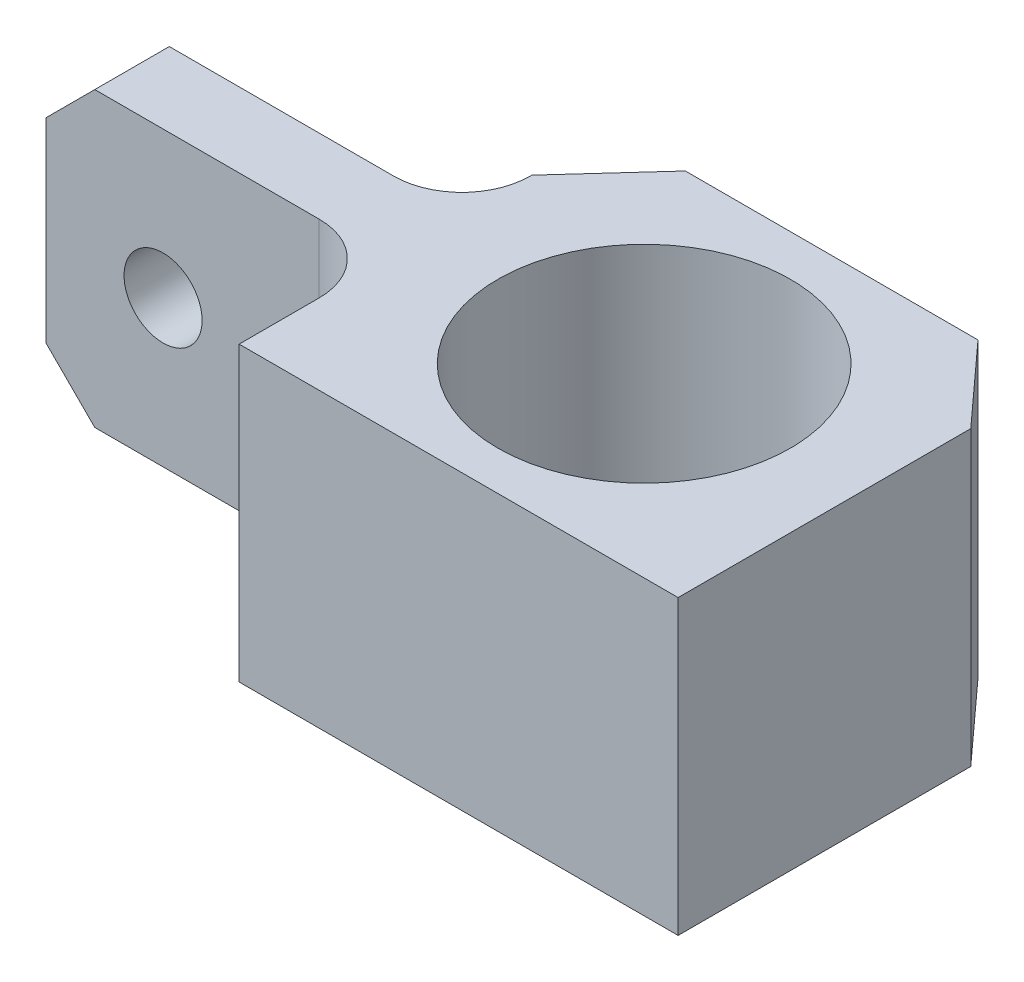
ISO-10303-21;
HEADER;
FILE_DESCRIPTION(('STEP AP214'),'2;1');
FILE_NAME('part.step','',(''),(''),'','','');
FILE_SCHEMA(('AUTOMOTIVE_DESIGN { 1 0 10303 214 1 1 1 1 }'));
ENDSEC;
DATA;
#1=APPLICATION_CONTEXT('core data for automotive mechanical design processes');
#2=APPLICATION_PROTOCOL_DEFINITION('international standard','automotive_design',2000,#1);
#3=PRODUCT_CONTEXT('',#1,'mechanical');
#4=PRODUCT('Part','Part','',(#3));
#5=PRODUCT_RELATED_PRODUCT_CATEGORY('part','',(#4));
#6=PRODUCT_DEFINITION_FORMATION('','',#4);
#7=PRODUCT_DEFINITION_CONTEXT('part definition',#1,'design');
#8=PRODUCT_DEFINITION('design','',#6,#7);
#9=PRODUCT_DEFINITION_SHAPE('','',#8);
#10=(LENGTH_UNIT() NAMED_UNIT(*) SI_UNIT(.MILLI.,.METRE.));
#11=(NAMED_UNIT(*) PLANE_ANGLE_UNIT() SI_UNIT($,.RADIAN.));
#12=(NAMED_UNIT(*) SI_UNIT($,.STERADIAN.) SOLID_ANGLE_UNIT());
#13=UNCERTAINTY_MEASURE_WITH_UNIT(LENGTH_MEASURE(1.E-05),#10,'distance_accuracy_value','');
#14=(GEOMETRIC_REPRESENTATION_CONTEXT(3) GLOBAL_UNCERTAINTY_ASSIGNED_CONTEXT((#13)) GLOBAL_UNIT_ASSIGNED_CONTEXT((#10,
#11,#12)) REPRESENTATION_CONTEXT('',''));
#15=CARTESIAN_POINT('',(0.,0.,0.));
#16=DIRECTION('',(0.,0.,1.));
#17=DIRECTION('',(1.,0.,0.));
#18=AXIS2_PLACEMENT_3D('',#15,#16,#17);
#19=CARTESIAN_POINT('',(-22.5,30.,19.019063341913));
#20=DIRECTION('',(1.,0.,0.));
#21=DIRECTION('',(0.,0.,-1.));
#22=AXIS2_PLACEMENT_3D('',#19,#20,#21);
#23=PLANE('',#22);
#24=DIRECTION('',(0.,0.,1.));
#25=VECTOR('',#24,1.);
#26=CARTESIAN_POINT('',(-22.5,30.,19.019063341913));
#27=LINE('',#26,#25);
#28=CARTESIAN_POINT('',(-22.5,30.,10.82));
#29=VERTEX_POINT('',#28);
#30=CARTESIAN_POINT('',(-22.5,30.,19.019063341913));
#31=VERTEX_POINT('',#30);
#32=EDGE_CURVE('E184',#29,#31,#27,.T.);
#33=ORIENTED_EDGE('',*,*,#32,.F.);
#34=DIRECTION('',(0.,1.,0.));
#35=VECTOR('',#34,1.);
#36=CARTESIAN_POINT('',(-22.5,0.,10.82));
#37=LINE('',#36,#35);
#38=CARTESIAN_POINT('',(-22.5,0.,10.82));
#39=VERTEX_POINT('',#38);
#40=EDGE_CURVE('E52',#29,#39,#37,.F.);
#41=ORIENTED_EDGE('',*,*,#40,.T.);
#42=DIRECTION('',(0.,0.,1.));
#43=VECTOR('',#42,1.);
#44=CARTESIAN_POINT('',(-22.5,0.,19.019063341913));
#45=LINE('',#44,#43);
#46=CARTESIAN_POINT('',(-22.5,0.,19.019063341913));
#47=VERTEX_POINT('',#46);
#48=EDGE_CURVE('E168',#39,#47,#45,.T.);
#49=ORIENTED_EDGE('',*,*,#48,.T.);
#50=DIRECTION('',(0.,-1.,0.));
#51=VECTOR('',#50,1.);
#52=CARTESIAN_POINT('',(-22.5,30.,19.019063341913));
#53=LINE('',#52,#51);
#54=EDGE_CURVE('E216',#31,#47,#53,.T.);
#55=ORIENTED_EDGE('',*,*,#54,.F.);
#56=EDGE_LOOP('',(#33,#41,#49,#55));
#57=FACE_BOUND('',#56,.T.);
#58=ADVANCED_FACE('F31',(#57),#23,.F.);
#59=CARTESIAN_POINT('',(-22.5,0.,-10.980936658087));
#60=VERTEX_POINT('',#59);
#61=CARTESIAN_POINT('',(-22.5,0.,-10.82));
#62=VERTEX_POINT('',#61);
#63=EDGE_CURVE('E164',#60,#62,#45,.T.);
#64=ORIENTED_EDGE('',*,*,#63,.T.);
#65=DIRECTION('',(0.,-1.,0.));
#66=VECTOR('',#65,1.);
#67=CARTESIAN_POINT('',(-22.5,30.,-10.82));
#68=LINE('',#67,#66);
#69=CARTESIAN_POINT('',(-22.5,30.,-10.82));
#70=VERTEX_POINT('',#69);
#71=EDGE_CURVE('E228',#62,#70,#68,.F.);
#72=ORIENTED_EDGE('',*,*,#71,.T.);
#73=CARTESIAN_POINT('',(-22.5,30.,-10.980936658087));
#74=VERTEX_POINT('',#73);
#75=EDGE_CURVE('E169',#74,#70,#27,.T.);
#76=ORIENTED_EDGE('',*,*,#75,.F.);
#77=DIRECTION('',(0.,-1.,0.));
#78=VECTOR('',#77,1.);
#79=CARTESIAN_POINT('',(-22.5,30.,-10.980936658087));
#80=LINE('',#79,#78);
#81=EDGE_CURVE('E208',#74,#60,#80,.T.);
#82=ORIENTED_EDGE('',*,*,#81,.T.);
#83=EDGE_LOOP('',(#64,#72,#76,#82));
#84=FACE_BOUND('',#83,.T.);
#85=ADVANCED_FACE('F213',(#84),#23,.F.);
#86=CARTESIAN_POINT('',(22.5,30.,-10.9809366580871));
#87=DIRECTION('',(-1.,0.,0.));
#88=DIRECTION('',(0.,0.,1.));
#89=AXIS2_PLACEMENT_3D('',#86,#87,#88);
#90=PLANE('',#89);
#91=DIRECTION('',(0.,0.,-1.));
#92=VECTOR('',#91,1.);
#93=CARTESIAN_POINT('',(22.5,0.,-10.9809366580871));
#94=LINE('',#93,#92);
#95=CARTESIAN_POINT('',(22.5,0.,19.0190633419129));
#96=VERTEX_POINT('',#95);
#97=CARTESIAN_POINT('',(22.5,0.,-10.9809366580871));
#98=VERTEX_POINT('',#97);
#99=EDGE_CURVE('E154',#96,#98,#94,.T.);
#100=ORIENTED_EDGE('',*,*,#99,.T.);
#101=DIRECTION('',(0.,-1.,0.));
#102=VECTOR('',#101,1.);
#103=CARTESIAN_POINT('',(22.5,30.,-10.9809366580871));
#104=LINE('',#103,#102);
#105=CARTESIAN_POINT('',(22.5,30.,-10.9809366580871));
#106=VERTEX_POINT('',#105);
#107=EDGE_CURVE('E134',#106,#98,#104,.T.);
#108=ORIENTED_EDGE('',*,*,#107,.F.);
#109=DIRECTION('',(0.,0.,-1.));
#110=VECTOR('',#109,1.);
#111=CARTESIAN_POINT('',(22.5,30.,-10.9809366580871));
#112=LINE('',#111,#110);
#113=CARTESIAN_POINT('',(22.5,30.,19.0190633419129));
#114=VERTEX_POINT('',#113);
#115=EDGE_CURVE('E140',#114,#106,#112,.T.);
#116=ORIENTED_EDGE('',*,*,#115,.F.);
#117=DIRECTION('',(0.,-1.,0.));
#118=VECTOR('',#117,1.);
#119=CARTESIAN_POINT('',(22.5,30.,19.0190633419129));
#120=LINE('',#119,#118);
#121=EDGE_CURVE('E193',#114,#96,#120,.T.);
#122=ORIENTED_EDGE('',*,*,#121,.T.);
#123=EDGE_LOOP('',(#100,#108,#116,#122));
#124=FACE_BOUND('',#123,.T.);
#125=ADVANCED_FACE('F152',(#124),#90,.F.);
#126=CARTESIAN_POINT('',(15.,30.,-19.2234627298298));
#127=DIRECTION('',(-0.739636528859752,0.,0.67300654170394));
#128=DIRECTION('',(0.67300654170394,0.,0.739636528859752));
#129=AXIS2_PLACEMENT_3D('',#126,#127,#128);
#130=PLANE('',#129);
#131=DIRECTION('',(-0.67300654170394,0.,-0.739636528859752));
#132=VECTOR('',#131,1.);
#133=CARTESIAN_POINT('',(15.,0.,-19.2234627298298));
#134=LINE('',#133,#132);
#135=CARTESIAN_POINT('',(15.,0.,-19.2234627298298));
#136=VERTEX_POINT('',#135);
#137=EDGE_CURVE('E195',#98,#136,#134,.T.);
#138=ORIENTED_EDGE('',*,*,#137,.T.);
#139=DIRECTION('',(0.,-1.,0.));
#140=VECTOR('',#139,1.);
#141=CARTESIAN_POINT('',(15.,30.,-19.2234627298298));
#142=LINE('',#141,#140);
#143=CARTESIAN_POINT('',(15.,30.,-19.2234627298298));
#144=VERTEX_POINT('',#143);
#145=EDGE_CURVE('E137',#144,#136,#142,.T.);
#146=ORIENTED_EDGE('',*,*,#145,.F.);
#147=DIRECTION('',(-0.67300654170394,0.,-0.739636528859752));
#148=VECTOR('',#147,1.);
#149=CARTESIAN_POINT('',(15.,30.,-19.2234627298298));
#150=LINE('',#149,#148);
#151=EDGE_CURVE('E130',#106,#144,#150,.T.);
#152=ORIENTED_EDGE('',*,*,#151,.F.);
#153=ORIENTED_EDGE('',*,*,#107,.T.);
#154=EDGE_LOOP('',(#138,#146,#152,#153));
#155=FACE_BOUND('',#154,.T.);
#156=ADVANCED_FACE('F132',(#155),#130,.F.);
#157=CARTESIAN_POINT('',(-15.,30.,-19.2234627298298));
#158=DIRECTION('',(0.,0.,1.));
#159=DIRECTION('',(1.,0.,0.));
#160=AXIS2_PLACEMENT_3D('',#157,#158,#159);
#161=PLANE('',#160);
#162=DIRECTION('',(-1.,0.,0.));
#163=VECTOR('',#162,1.);
#164=CARTESIAN_POINT('',(-15.,0.,-19.2234627298298));
#165=LINE('',#164,#163);
#166=CARTESIAN_POINT('',(-15.,0.,-19.2234627298298));
#167=VERTEX_POINT('',#166);
#168=EDGE_CURVE('E197',#136,#167,#165,.T.);
#169=ORIENTED_EDGE('',*,*,#168,.T.);
#170=DIRECTION('',(0.,-1.,0.));
#171=VECTOR('',#170,1.);
#172=CARTESIAN_POINT('',(-15.,30.,-19.2234627298298));
#173=LINE('',#172,#171);
#174=CARTESIAN_POINT('',(-15.,30.,-19.2234627298298));
#175=VERTEX_POINT('',#174);
#176=EDGE_CURVE('E160',#175,#167,#173,.T.);
#177=ORIENTED_EDGE('',*,*,#176,.F.);
#178=DIRECTION('',(-1.,0.,0.));
#179=VECTOR('',#178,1.);
#180=CARTESIAN_POINT('',(-15.,30.,-19.2234627298298));
#181=LINE('',#180,#179);
#182=EDGE_CURVE('E139',#144,#175,#181,.T.);
#183=ORIENTED_EDGE('',*,*,#182,.F.);
#184=ORIENTED_EDGE('',*,*,#145,.T.);
#185=EDGE_LOOP('',(#169,#177,#183,#184));
#186=FACE_BOUND('',#185,.T.);
#187=ADVANCED_FACE('F319',(#186),#161,.F.);
#188=CARTESIAN_POINT('',(-22.5,30.,-10.980936658087));
#189=DIRECTION('',(0.739636528859752,0.,0.67300654170394));
#190=DIRECTION('',(0.67300654170394,0.,-0.739636528859752));
#191=AXIS2_PLACEMENT_3D('',#188,#189,#190);
#192=PLANE('',#191);
#193=DIRECTION('',(-0.67300654170394,0.,0.739636528859752));
#194=VECTOR('',#193,1.);
#195=CARTESIAN_POINT('',(-22.5,0.,-10.980936658087));
#196=LINE('',#195,#194);
#197=EDGE_CURVE('E175',#167,#60,#196,.T.);
#198=ORIENTED_EDGE('',*,*,#197,.T.);
#199=ORIENTED_EDGE('',*,*,#81,.F.);
#200=DIRECTION('',(-0.67300654170394,0.,0.739636528859752));
#201=VECTOR('',#200,1.);
#202=CARTESIAN_POINT('',(-22.5,30.,-10.980936658087));
#203=LINE('',#202,#201);
#204=EDGE_CURVE('E186',#175,#74,#203,.T.);
#205=ORIENTED_EDGE('',*,*,#204,.F.);
#206=ORIENTED_EDGE('',*,*,#176,.T.);
#207=EDGE_LOOP('',(#198,#199,#205,#206));
#208=FACE_BOUND('',#207,.T.);
#209=ADVANCED_FACE('F206',(#208),#192,.F.);
#210=CARTESIAN_POINT('',(22.5,30.,19.0190633419129));
#211=DIRECTION('',(0.,0.,-1.));
#212=DIRECTION('',(-1.,0.,0.));
#213=AXIS2_PLACEMENT_3D('',#210,#211,#212);
#214=PLANE('',#213);
#215=DIRECTION('',(1.,0.,0.));
#216=VECTOR('',#215,1.);
#217=CARTESIAN_POINT('',(22.5,0.,19.0190633419129));
#218=LINE('',#217,#216);
#219=EDGE_CURVE('E150',#47,#96,#218,.T.);
#220=ORIENTED_EDGE('',*,*,#219,.T.);
#221=ORIENTED_EDGE('',*,*,#121,.F.);
#222=DIRECTION('',(1.,0.,0.));
#223=VECTOR('',#222,1.);
#224=CARTESIAN_POINT('',(22.5,30.,19.0190633419129));
#225=LINE('',#224,#223);
#226=EDGE_CURVE('E146',#31,#114,#225,.T.);
#227=ORIENTED_EDGE('',*,*,#226,.F.);
#228=ORIENTED_EDGE('',*,*,#54,.T.);
#229=EDGE_LOOP('',(#220,#221,#227,#228));
#230=FACE_BOUND('',#229,.T.);
#231=ADVANCED_FACE('F315',(#230),#214,.F.);
#232=CARTESIAN_POINT('',(22.5,30.,19.0190633419129));
#233=DIRECTION('',(0.,-1.,0.));
#234=DIRECTION('',(0.,0.,-1.));
#235=AXIS2_PLACEMENT_3D('',#232,#233,#234);
#236=PLANE('',#235);
#237=CARTESIAN_POINT('',(0.,30.,0.));
#238=DIRECTION('',(0.,1.,0.));
#239=DIRECTION('',(0.,0.,1.));
#240=AXIS2_PLACEMENT_3D('',#237,#238,#239);
#241=CIRCLE('',#240,15.);
#242=CARTESIAN_POINT('',(0.,30.,15.));
#243=VERTEX_POINT('',#242);
#244=EDGE_CURVE('E261',#243,#243,#241,.T.);
#245=ORIENTED_EDGE('',*,*,#244,.F.);
#246=EDGE_LOOP('',(#245));
#247=FACE_BOUND('',#246,.T.);
#248=DIRECTION('',(1.,0.,0.));
#249=VECTOR('',#248,1.);
#250=CARTESIAN_POINT('',(-57.5,30.,-3.81999999999999));
#251=LINE('',#250,#249);
#252=CARTESIAN_POINT('',(-52.5,30.,-3.81999999999999));
#253=VERTEX_POINT('',#252);
#254=CARTESIAN_POINT('',(-29.5,30.,-3.81999999999999));
#255=VERTEX_POINT('',#254);
#256=EDGE_CURVE('E246',#253,#255,#251,.T.);
#257=ORIENTED_EDGE('',*,*,#256,.F.);
#258=DIRECTION('',(0.,0.,1.));
#259=VECTOR('',#258,1.);
#260=CARTESIAN_POINT('',(-52.5,30.,3.82000000000001));
#261=LINE('',#260,#259);
#262=CARTESIAN_POINT('',(-52.5,30.,3.82000000000001));
#263=VERTEX_POINT('',#262);
#264=EDGE_CURVE('E234',#253,#263,#261,.T.);
#265=ORIENTED_EDGE('',*,*,#264,.T.);
#266=DIRECTION('',(1.,0.,0.));
#267=VECTOR('',#266,1.);
#268=CARTESIAN_POINT('',(-57.5,30.,3.82000000000001));
#269=LINE('',#268,#267);
#270=CARTESIAN_POINT('',(-29.5,30.,3.82000000000001));
#271=VERTEX_POINT('',#270);
#272=EDGE_CURVE('E250',#263,#271,#269,.T.);
#273=ORIENTED_EDGE('',*,*,#272,.T.);
#274=CARTESIAN_POINT('',(-29.5,30.,10.82));
#275=DIRECTION('',(0.,-1.,0.));
#276=DIRECTION('',(0.,0.,-1.));
#277=AXIS2_PLACEMENT_3D('',#274,#275,#276);
#278=CIRCLE('',#277,7.);
#279=EDGE_CURVE('E39',#271,#29,#278,.T.);
#280=ORIENTED_EDGE('',*,*,#279,.T.);
#281=ORIENTED_EDGE('',*,*,#32,.T.);
#282=ORIENTED_EDGE('',*,*,#226,.T.);
#283=ORIENTED_EDGE('',*,*,#115,.T.);
#284=ORIENTED_EDGE('',*,*,#151,.T.);
#285=ORIENTED_EDGE('',*,*,#182,.T.);
#286=ORIENTED_EDGE('',*,*,#204,.T.);
#287=ORIENTED_EDGE('',*,*,#75,.T.);
#288=CARTESIAN_POINT('',(-29.5,30.,-10.82));
#289=DIRECTION('',(0.,-1.,0.));
#290=DIRECTION('',(0.,0.,-1.));
#291=AXIS2_PLACEMENT_3D('',#288,#289,#290);
#292=CIRCLE('',#291,7.);
#293=EDGE_CURVE('E227',#70,#255,#292,.T.);
#294=ORIENTED_EDGE('',*,*,#293,.T.);
#295=EDGE_LOOP('',(#257,#265,#273,#280,#281,#282,#283,#284,#285,#286,#287,#294));
#296=FACE_BOUND('',#295,.T.);
#297=ADVANCED_FACE('F144',(#247,#296),#236,.F.);
#298=CARTESIAN_POINT('',(22.5,0.,19.0190633419129));
#299=DIRECTION('',(0.,-1.,0.));
#300=DIRECTION('',(0.,0.,-1.));
#301=AXIS2_PLACEMENT_3D('',#298,#299,#300);
#302=PLANE('',#301);
#303=CARTESIAN_POINT('',(0.,0.,0.));
#304=DIRECTION('',(0.,1.,0.));
#305=DIRECTION('',(0.,0.,1.));
#306=AXIS2_PLACEMENT_3D('',#303,#304,#305);
#307=CIRCLE('',#306,15.);
#308=CARTESIAN_POINT('',(0.,0.,15.));
#309=VERTEX_POINT('',#308);
#310=EDGE_CURVE('E196',#309,#309,#307,.T.);
#311=ORIENTED_EDGE('',*,*,#310,.T.);
#312=EDGE_LOOP('',(#311));
#313=FACE_BOUND('',#312,.T.);
#314=DIRECTION('',(1.,0.,0.));
#315=VECTOR('',#314,1.);
#316=CARTESIAN_POINT('',(-57.5,0.,3.82000000000001));
#317=LINE('',#316,#315);
#318=CARTESIAN_POINT('',(-52.5,0.,3.82000000000001));
#319=VERTEX_POINT('',#318);
#320=CARTESIAN_POINT('',(-29.5,0.,3.82000000000001));
#321=VERTEX_POINT('',#320);
#322=EDGE_CURVE('E262',#319,#321,#317,.T.);
#323=ORIENTED_EDGE('',*,*,#322,.F.);
#324=DIRECTION('',(0.,0.,-1.));
#325=VECTOR('',#324,1.);
#326=CARTESIAN_POINT('',(-52.5,0.,19.0190633419129));
#327=LINE('',#326,#325);
#328=CARTESIAN_POINT('',(-52.5,0.,-3.81999999999999));
#329=VERTEX_POINT('',#328);
#330=EDGE_CURVE('E245',#319,#329,#327,.T.);
#331=ORIENTED_EDGE('',*,*,#330,.T.);
#332=DIRECTION('',(1.,0.,0.));
#333=VECTOR('',#332,1.);
#334=CARTESIAN_POINT('',(-57.5,0.,-3.81999999999999));
#335=LINE('',#334,#333);
#336=CARTESIAN_POINT('',(-29.5,0.,-3.81999999999999));
#337=VERTEX_POINT('',#336);
#338=EDGE_CURVE('E223',#329,#337,#335,.T.);
#339=ORIENTED_EDGE('',*,*,#338,.T.);
#340=CARTESIAN_POINT('',(-29.5,0.,-10.82));
#341=DIRECTION('',(0.,-1.,0.));
#342=DIRECTION('',(0.,0.,-1.));
#343=AXIS2_PLACEMENT_3D('',#340,#341,#342);
#344=CIRCLE('',#343,7.);
#345=EDGE_CURVE('E221',#337,#62,#344,.F.);
#346=ORIENTED_EDGE('',*,*,#345,.T.);
#347=ORIENTED_EDGE('',*,*,#63,.F.);
#348=ORIENTED_EDGE('',*,*,#197,.F.);
#349=ORIENTED_EDGE('',*,*,#168,.F.);
#350=ORIENTED_EDGE('',*,*,#137,.F.);
#351=ORIENTED_EDGE('',*,*,#99,.F.);
#352=ORIENTED_EDGE('',*,*,#219,.F.);
#353=ORIENTED_EDGE('',*,*,#48,.F.);
#354=CARTESIAN_POINT('',(-29.5,0.,10.82));
#355=DIRECTION('',(0.,-1.,0.));
#356=DIRECTION('',(0.,0.,-1.));
#357=AXIS2_PLACEMENT_3D('',#354,#355,#356);
#358=CIRCLE('',#357,7.);
#359=EDGE_CURVE('E11',#39,#321,#358,.F.);
#360=ORIENTED_EDGE('',*,*,#359,.T.);
#361=EDGE_LOOP('',(#323,#331,#339,#346,#347,#348,#349,#350,#351,#352,#353,#360));
#362=FACE_BOUND('',#361,.T.);
#363=ADVANCED_FACE('F219',(#313,#362),#302,.T.);
#364=CARTESIAN_POINT('',(0.,0.,0.));
#365=DIRECTION('',(0.,1.,0.));
#366=DIRECTION('',(0.,0.,1.));
#367=AXIS2_PLACEMENT_3D('',#364,#365,#366);
#368=CYLINDRICAL_SURFACE('',#367,15.);
#369=ORIENTED_EDGE('',*,*,#310,.F.);
#370=EDGE_LOOP('',(#369));
#371=FACE_BOUND('',#370,.T.);
#372=ORIENTED_EDGE('',*,*,#244,.T.);
#373=EDGE_LOOP('',(#372));
#374=FACE_BOUND('',#373,.T.);
#375=ADVANCED_FACE('F349',(#371,#374),#368,.F.);
#376=CARTESIAN_POINT('',(-57.5,30.,3.82000000000001));
#377=DIRECTION('',(0.,0.,-1.));
#378=DIRECTION('',(-1.,0.,0.));
#379=AXIS2_PLACEMENT_3D('',#376,#377,#378);
#380=PLANE('',#379);
#381=CARTESIAN_POINT('',(-45.5,15.,3.82));
#382=DIRECTION('',(0.,0.,1.));
#383=DIRECTION('',(1.,0.,0.));
#384=AXIS2_PLACEMENT_3D('',#381,#382,#383);
#385=CIRCLE('',#384,4.00000000000001);
#386=CARTESIAN_POINT('',(-41.5,15.,3.82));
#387=VERTEX_POINT('',#386);
#388=EDGE_CURVE('E239',#387,#387,#385,.T.);
#389=ORIENTED_EDGE('',*,*,#388,.F.);
#390=EDGE_LOOP('',(#389));
#391=FACE_BOUND('',#390,.T.);
#392=ORIENTED_EDGE('',*,*,#322,.T.);
#393=DIRECTION('',(0.,1.,0.));
#394=VECTOR('',#393,1.);
#395=CARTESIAN_POINT('',(-29.5,30.,3.82000000000001));
#396=LINE('',#395,#394);
#397=EDGE_CURVE('E182',#321,#271,#396,.T.);
#398=ORIENTED_EDGE('',*,*,#397,.T.);
#399=ORIENTED_EDGE('',*,*,#272,.F.);
#400=DIRECTION('',(-0.707106781186549,-0.707106781186546,0.));
#401=VECTOR('',#400,1.);
#402=CARTESIAN_POINT('',(-57.5,25.,3.82000000000001));
#403=LINE('',#402,#401);
#404=CARTESIAN_POINT('',(-57.5,25.,3.82000000000001));
#405=VERTEX_POINT('',#404);
#406=EDGE_CURVE('E266',#263,#405,#403,.T.);
#407=ORIENTED_EDGE('',*,*,#406,.T.);
#408=DIRECTION('',(0.,1.,0.));
#409=VECTOR('',#408,1.);
#410=CARTESIAN_POINT('',(-57.5,30.,3.82000000000001));
#411=LINE('',#410,#409);
#412=CARTESIAN_POINT('',(-57.5,4.99999999999998,3.82000000000001));
#413=VERTEX_POINT('',#412);
#414=EDGE_CURVE('E238',#413,#405,#411,.T.);
#415=ORIENTED_EDGE('',*,*,#414,.F.);
#416=DIRECTION('',(-0.707106781186549,0.707106781186546,0.));
#417=VECTOR('',#416,1.);
#418=CARTESIAN_POINT('',(-57.5,4.99999999999998,3.82000000000001));
#419=LINE('',#418,#417);
#420=EDGE_CURVE('E268',#413,#319,#419,.F.);
#421=ORIENTED_EDGE('',*,*,#420,.T.);
#422=EDGE_LOOP('',(#392,#398,#399,#407,#415,#421));
#423=FACE_BOUND('',#422,.T.);
#424=ADVANCED_FACE('F285',(#391,#423),#380,.F.);
#425=CARTESIAN_POINT('',(-57.5,30.,-3.81999999999999));
#426=DIRECTION('',(0.,0.,1.));
#427=DIRECTION('',(1.,0.,0.));
#428=AXIS2_PLACEMENT_3D('',#425,#426,#427);
#429=PLANE('',#428);
#430=CARTESIAN_POINT('',(-45.5,15.,-3.81999999999999));
#431=DIRECTION('',(0.,0.,1.));
#432=DIRECTION('',(1.,0.,0.));
#433=AXIS2_PLACEMENT_3D('',#430,#431,#432);
#434=CIRCLE('',#433,4.00000000000001);
#435=CARTESIAN_POINT('',(-41.5,15.,-3.81999999999999));
#436=VERTEX_POINT('',#435);
#437=EDGE_CURVE('E235',#436,#436,#434,.T.);
#438=ORIENTED_EDGE('',*,*,#437,.T.);
#439=EDGE_LOOP('',(#438));
#440=FACE_BOUND('',#439,.T.);
#441=ORIENTED_EDGE('',*,*,#256,.T.);
#442=DIRECTION('',(0.,-1.,0.));
#443=VECTOR('',#442,1.);
#444=CARTESIAN_POINT('',(-29.5,0.,-3.81999999999999));
#445=LINE('',#444,#443);
#446=EDGE_CURVE('E230',#255,#337,#445,.T.);
#447=ORIENTED_EDGE('',*,*,#446,.T.);
#448=ORIENTED_EDGE('',*,*,#338,.F.);
#449=DIRECTION('',(0.707106781186549,-0.707106781186546,0.));
#450=VECTOR('',#449,1.);
#451=CARTESIAN_POINT('',(-57.5,4.99999999999998,-3.81999999999999));
#452=LINE('',#451,#450);
#453=CARTESIAN_POINT('',(-57.5,4.99999999999998,-3.81999999999999));
#454=VERTEX_POINT('',#453);
#455=EDGE_CURVE('E241',#329,#454,#452,.F.);
#456=ORIENTED_EDGE('',*,*,#455,.T.);
#457=DIRECTION('',(0.,-1.,0.));
#458=VECTOR('',#457,1.);
#459=CARTESIAN_POINT('',(-57.5,30.,-3.81999999999999));
#460=LINE('',#459,#458);
#461=CARTESIAN_POINT('',(-57.5,25.,-3.81999999999999));
#462=VERTEX_POINT('',#461);
#463=EDGE_CURVE('E265',#462,#454,#460,.T.);
#464=ORIENTED_EDGE('',*,*,#463,.F.);
#465=DIRECTION('',(0.707106781186549,0.707106781186546,0.));
#466=VECTOR('',#465,1.);
#467=CARTESIAN_POINT('',(-57.5,25.,-3.81999999999999));
#468=LINE('',#467,#466);
#469=EDGE_CURVE('E243',#462,#253,#468,.T.);
#470=ORIENTED_EDGE('',*,*,#469,.T.);
#471=EDGE_LOOP('',(#441,#447,#448,#456,#464,#470));
#472=FACE_BOUND('',#471,.T.);
#473=ADVANCED_FACE('F275',(#440,#472),#429,.F.);
#474=CARTESIAN_POINT('',(-57.5,0.,3.82000000000001));
#475=DIRECTION('',(-1.,0.,0.));
#476=DIRECTION('',(0.,0.,1.));
#477=AXIS2_PLACEMENT_3D('',#474,#475,#476);
#478=PLANE('',#477);
#479=ORIENTED_EDGE('',*,*,#463,.T.);
#480=DIRECTION('',(0.,0.,1.));
#481=VECTOR('',#480,1.);
#482=CARTESIAN_POINT('',(-57.5,4.99999999999998,3.82000000000001));
#483=LINE('',#482,#481);
#484=EDGE_CURVE('E158',#454,#413,#483,.T.);
#485=ORIENTED_EDGE('',*,*,#484,.T.);
#486=ORIENTED_EDGE('',*,*,#414,.T.);
#487=DIRECTION('',(0.,0.,-1.));
#488=VECTOR('',#487,1.);
#489=CARTESIAN_POINT('',(-57.5,25.,-3.81999999999999));
#490=LINE('',#489,#488);
#491=EDGE_CURVE('E155',#405,#462,#490,.T.);
#492=ORIENTED_EDGE('',*,*,#491,.T.);
#493=EDGE_LOOP('',(#479,#485,#486,#492));
#494=FACE_BOUND('',#493,.T.);
#495=ADVANCED_FACE('F283',(#494),#478,.T.);
#496=CARTESIAN_POINT('',(-57.5,4.99999999999998,3.82000000000001));
#497=DIRECTION('',(0.707106781186546,0.707106781186549,0.));
#498=DIRECTION('',(-0.707106781186549,0.707106781186546,0.));
#499=AXIS2_PLACEMENT_3D('',#496,#497,#498);
#500=PLANE('',#499);
#501=ORIENTED_EDGE('',*,*,#455,.F.);
#502=ORIENTED_EDGE('',*,*,#330,.F.);
#503=ORIENTED_EDGE('',*,*,#420,.F.);
#504=ORIENTED_EDGE('',*,*,#484,.F.);
#505=EDGE_LOOP('',(#501,#502,#503,#504));
#506=FACE_BOUND('',#505,.T.);
#507=ADVANCED_FACE('F279',(#506),#500,.F.);
#508=CARTESIAN_POINT('',(-57.5,25.,3.82000000000001));
#509=DIRECTION('',(-0.707106781186546,0.707106781186549,0.));
#510=DIRECTION('',(-0.707106781186549,-0.707106781186546,0.));
#511=AXIS2_PLACEMENT_3D('',#508,#509,#510);
#512=PLANE('',#511);
#513=ORIENTED_EDGE('',*,*,#406,.F.);
#514=ORIENTED_EDGE('',*,*,#264,.F.);
#515=ORIENTED_EDGE('',*,*,#469,.F.);
#516=ORIENTED_EDGE('',*,*,#491,.F.);
#517=EDGE_LOOP('',(#513,#514,#515,#516));
#518=FACE_BOUND('',#517,.T.);
#519=ADVANCED_FACE('F304',(#518),#512,.T.);
#520=CARTESIAN_POINT('',(-45.5,15.,-19.2234627298298));
#521=DIRECTION('',(0.,0.,1.));
#522=DIRECTION('',(1.,0.,0.));
#523=AXIS2_PLACEMENT_3D('',#520,#521,#522);
#524=CYLINDRICAL_SURFACE('',#523,4.00000000000001);
#525=ORIENTED_EDGE('',*,*,#388,.T.);
#526=EDGE_LOOP('',(#525));
#527=FACE_BOUND('',#526,.T.);
#528=ORIENTED_EDGE('',*,*,#437,.F.);
#529=EDGE_LOOP('',(#528));
#530=FACE_BOUND('',#529,.T.);
#531=ADVANCED_FACE('F298',(#527,#530),#524,.F.);
#532=CARTESIAN_POINT('',(-29.5,30.,-10.82));
#533=DIRECTION('',(0.,1.,0.));
#534=DIRECTION('',(0.,0.,1.));
#535=AXIS2_PLACEMENT_3D('',#532,#533,#534);
#536=CYLINDRICAL_SURFACE('',#535,7.);
#537=ORIENTED_EDGE('',*,*,#293,.F.);
#538=ORIENTED_EDGE('',*,*,#71,.F.);
#539=ORIENTED_EDGE('',*,*,#345,.F.);
#540=ORIENTED_EDGE('',*,*,#446,.F.);
#541=EDGE_LOOP('',(#537,#538,#539,#540));
#542=FACE_BOUND('',#541,.T.);
#543=ADVANCED_FACE('F296',(#542),#536,.F.);
#544=CARTESIAN_POINT('',(-29.5,30.,10.82));
#545=DIRECTION('',(0.,-1.,0.));
#546=DIRECTION('',(0.,0.,-1.));
#547=AXIS2_PLACEMENT_3D('',#544,#545,#546);
#548=CYLINDRICAL_SURFACE('',#547,7.);
#549=ORIENTED_EDGE('',*,*,#359,.F.);
#550=ORIENTED_EDGE('',*,*,#40,.F.);
#551=ORIENTED_EDGE('',*,*,#279,.F.);
#552=ORIENTED_EDGE('',*,*,#397,.F.);
#553=EDGE_LOOP('',(#549,#550,#551,#552));
#554=FACE_BOUND('',#553,.T.);
#555=ADVANCED_FACE('F33',(#554),#548,.F.);
#556=CLOSED_SHELL('',(#58,#85,#125,#156,#187,#209,#231,#297,#363,#375,#424,#473,#495,#507,#519,
#531,#543,#555));
#557=MANIFOLD_SOLID_BREP('B2',#556);
#558=ADVANCED_BREP_SHAPE_REPRESENTATION('',(#18,#557),#14);
#559=SHAPE_DEFINITION_REPRESENTATION(#9,#558);
ENDSEC;
END-ISO-10303-21;
